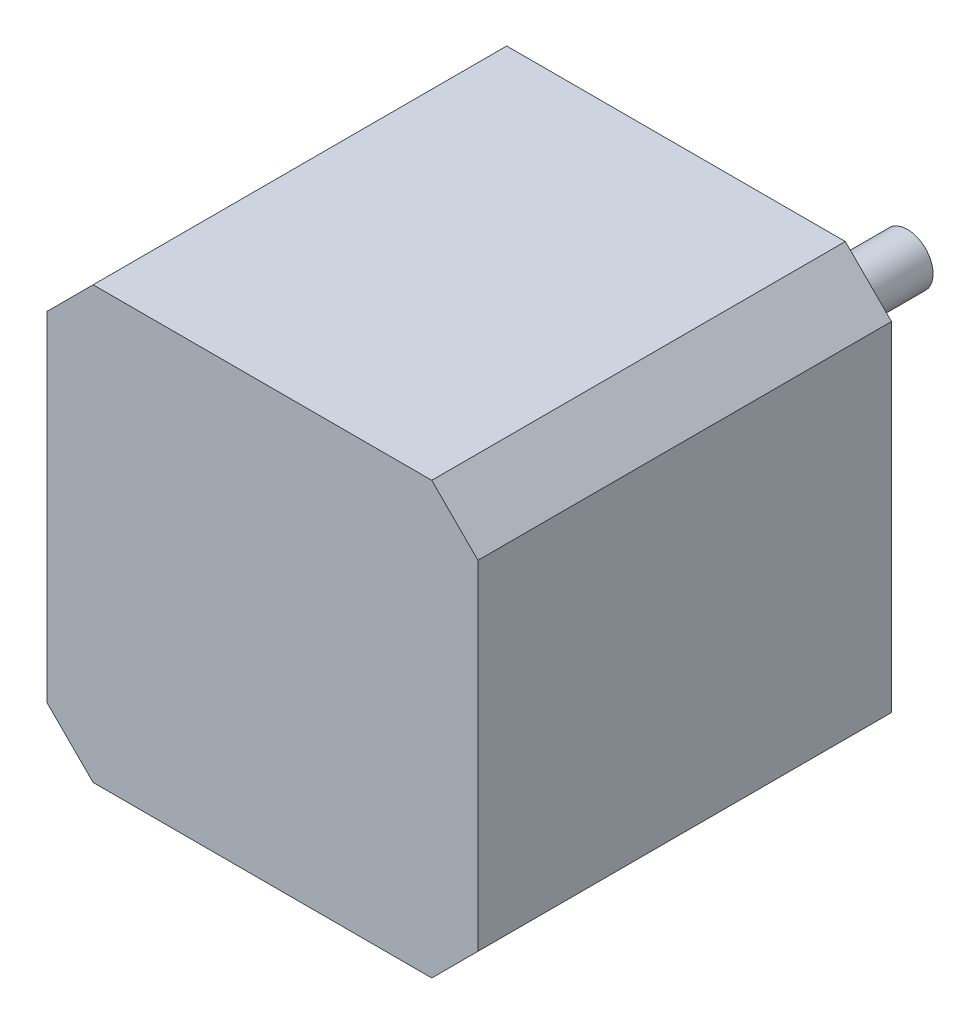
ISO-10303-21;
HEADER;
FILE_DESCRIPTION(('STEP AP214'),'2;1');
FILE_NAME('part.step','',(''),(''),'','','');
FILE_SCHEMA(('AUTOMOTIVE_DESIGN { 1 0 10303 214 1 1 1 1 }'));
ENDSEC;
DATA;
#1=APPLICATION_CONTEXT('core data for automotive mechanical design processes');
#2=APPLICATION_PROTOCOL_DEFINITION('international standard','automotive_design',2000,#1);
#3=PRODUCT_CONTEXT('',#1,'mechanical');
#4=PRODUCT('Part','Part','',(#3));
#5=PRODUCT_RELATED_PRODUCT_CATEGORY('part','',(#4));
#6=PRODUCT_DEFINITION_FORMATION('','',#4);
#7=PRODUCT_DEFINITION_CONTEXT('part definition',#1,'design');
#8=PRODUCT_DEFINITION('design','',#6,#7);
#9=PRODUCT_DEFINITION_SHAPE('','',#8);
#10=(LENGTH_UNIT() NAMED_UNIT(*) SI_UNIT(.MILLI.,.METRE.));
#11=(NAMED_UNIT(*) PLANE_ANGLE_UNIT() SI_UNIT($,.RADIAN.));
#12=(NAMED_UNIT(*) SI_UNIT($,.STERADIAN.) SOLID_ANGLE_UNIT());
#13=UNCERTAINTY_MEASURE_WITH_UNIT(LENGTH_MEASURE(1.E-05),#10,'distance_accuracy_value','');
#14=(GEOMETRIC_REPRESENTATION_CONTEXT(3) GLOBAL_UNCERTAINTY_ASSIGNED_CONTEXT((#13)) GLOBAL_UNIT_ASSIGNED_CONTEXT((#10,
#11,#12)) REPRESENTATION_CONTEXT('',''));
#15=CARTESIAN_POINT('',(0.,0.,0.));
#16=DIRECTION('',(0.,0.,1.));
#17=DIRECTION('',(1.,0.,0.));
#18=AXIS2_PLACEMENT_3D('',#15,#16,#17);
#19=CARTESIAN_POINT('',(0.,-21.,40.3));
#20=DIRECTION('',(0.,1.,0.));
#21=DIRECTION('',(0.,0.,1.));
#22=AXIS2_PLACEMENT_3D('',#19,#20,#21);
#23=PLANE('',#22);
#24=DIRECTION('',(1.,0.,0.));
#25=VECTOR('',#24,1.);
#26=CARTESIAN_POINT('',(0.,-21.,0.));
#27=LINE('',#26,#25);
#28=CARTESIAN_POINT('',(-16.5,-21.,0.));
#29=VERTEX_POINT('',#28);
#30=CARTESIAN_POINT('',(16.5,-21.,0.));
#31=VERTEX_POINT('',#30);
#32=EDGE_CURVE('E162',#29,#31,#27,.T.);
#33=ORIENTED_EDGE('',*,*,#32,.T.);
#34=DIRECTION('',(0.,0.,1.));
#35=VECTOR('',#34,1.);
#36=CARTESIAN_POINT('',(16.5,-21.,40.3));
#37=LINE('',#36,#35);
#38=CARTESIAN_POINT('',(16.5,-21.,40.3));
#39=VERTEX_POINT('',#38);
#40=EDGE_CURVE('E147',#31,#39,#37,.T.);
#41=ORIENTED_EDGE('',*,*,#40,.T.);
#42=DIRECTION('',(1.,0.,0.));
#43=VECTOR('',#42,1.);
#44=CARTESIAN_POINT('',(0.,-21.,40.3));
#45=LINE('',#44,#43);
#46=CARTESIAN_POINT('',(-16.5,-21.,40.3));
#47=VERTEX_POINT('',#46);
#48=EDGE_CURVE('E164',#47,#39,#45,.T.);
#49=ORIENTED_EDGE('',*,*,#48,.F.);
#50=DIRECTION('',(0.,0.,-1.));
#51=VECTOR('',#50,1.);
#52=CARTESIAN_POINT('',(-16.5,-21.,0.));
#53=LINE('',#52,#51);
#54=EDGE_CURVE('E144',#47,#29,#53,.T.);
#55=ORIENTED_EDGE('',*,*,#54,.T.);
#56=EDGE_LOOP('',(#33,#41,#49,#55));
#57=FACE_BOUND('',#56,.T.);
#58=ADVANCED_FACE('F34',(#57),#23,.F.);
#59=CARTESIAN_POINT('',(21.,0.,40.3));
#60=DIRECTION('',(-1.,0.,0.));
#61=DIRECTION('',(0.,0.,1.));
#62=AXIS2_PLACEMENT_3D('',#59,#60,#61);
#63=PLANE('',#62);
#64=DIRECTION('',(0.,1.,0.));
#65=VECTOR('',#64,1.);
#66=CARTESIAN_POINT('',(21.,0.,0.));
#67=LINE('',#66,#65);
#68=CARTESIAN_POINT('',(21.,-16.5,0.));
#69=VERTEX_POINT('',#68);
#70=CARTESIAN_POINT('',(21.,16.5,0.));
#71=VERTEX_POINT('',#70);
#72=EDGE_CURVE('E118',#69,#71,#67,.T.);
#73=ORIENTED_EDGE('',*,*,#72,.T.);
#74=DIRECTION('',(0.,0.,1.));
#75=VECTOR('',#74,1.);
#76=CARTESIAN_POINT('',(21.,16.5,40.3));
#77=LINE('',#76,#75);
#78=CARTESIAN_POINT('',(21.,16.5,40.3));
#79=VERTEX_POINT('',#78);
#80=EDGE_CURVE('E135',#71,#79,#77,.T.);
#81=ORIENTED_EDGE('',*,*,#80,.T.);
#82=DIRECTION('',(0.,1.,0.));
#83=VECTOR('',#82,1.);
#84=CARTESIAN_POINT('',(21.,0.,40.3));
#85=LINE('',#84,#83);
#86=CARTESIAN_POINT('',(21.,-16.5,40.3));
#87=VERTEX_POINT('',#86);
#88=EDGE_CURVE('E175',#87,#79,#85,.T.);
#89=ORIENTED_EDGE('',*,*,#88,.F.);
#90=DIRECTION('',(0.,0.,-1.));
#91=VECTOR('',#90,1.);
#92=CARTESIAN_POINT('',(21.,-16.5,40.3));
#93=LINE('',#92,#91);
#94=EDGE_CURVE('E132',#87,#69,#93,.T.);
#95=ORIENTED_EDGE('',*,*,#94,.T.);
#96=EDGE_LOOP('',(#73,#81,#89,#95));
#97=FACE_BOUND('',#96,.T.);
#98=ADVANCED_FACE('F254',(#97),#63,.F.);
#99=CARTESIAN_POINT('',(0.,21.,40.3));
#100=DIRECTION('',(0.,1.,0.));
#101=DIRECTION('',(0.,0.,1.));
#102=AXIS2_PLACEMENT_3D('',#99,#100,#101);
#103=PLANE('',#102);
#104=DIRECTION('',(1.,0.,0.));
#105=VECTOR('',#104,1.);
#106=CARTESIAN_POINT('',(0.,21.,40.3));
#107=LINE('',#106,#105);
#108=CARTESIAN_POINT('',(-16.5,21.,40.3));
#109=VERTEX_POINT('',#108);
#110=CARTESIAN_POINT('',(16.5,21.,40.3));
#111=VERTEX_POINT('',#110);
#112=EDGE_CURVE('E123',#109,#111,#107,.T.);
#113=ORIENTED_EDGE('',*,*,#112,.T.);
#114=DIRECTION('',(0.,0.,-1.));
#115=VECTOR('',#114,1.);
#116=CARTESIAN_POINT('',(16.5,21.,0.));
#117=LINE('',#116,#115);
#118=CARTESIAN_POINT('',(16.5,21.,0.));
#119=VERTEX_POINT('',#118);
#120=EDGE_CURVE('E110',#111,#119,#117,.T.);
#121=ORIENTED_EDGE('',*,*,#120,.T.);
#122=DIRECTION('',(1.,0.,0.));
#123=VECTOR('',#122,1.);
#124=CARTESIAN_POINT('',(0.,21.,0.));
#125=LINE('',#124,#123);
#126=CARTESIAN_POINT('',(-16.5,21.,0.));
#127=VERTEX_POINT('',#126);
#128=EDGE_CURVE('E103',#127,#119,#125,.T.);
#129=ORIENTED_EDGE('',*,*,#128,.F.);
#130=DIRECTION('',(0.,0.,1.));
#131=VECTOR('',#130,1.);
#132=CARTESIAN_POINT('',(-16.5,21.,40.3));
#133=LINE('',#132,#131);
#134=EDGE_CURVE('E116',#127,#109,#133,.T.);
#135=ORIENTED_EDGE('',*,*,#134,.T.);
#136=EDGE_LOOP('',(#113,#121,#129,#135));
#137=FACE_BOUND('',#136,.T.);
#138=ADVANCED_FACE('F115',(#137),#103,.T.);
#139=CARTESIAN_POINT('',(-21.,0.,40.3));
#140=DIRECTION('',(-1.,0.,0.));
#141=DIRECTION('',(0.,0.,1.));
#142=AXIS2_PLACEMENT_3D('',#139,#140,#141);
#143=PLANE('',#142);
#144=DIRECTION('',(0.,1.,0.));
#145=VECTOR('',#144,1.);
#146=CARTESIAN_POINT('',(-21.,0.,0.));
#147=LINE('',#146,#145);
#148=CARTESIAN_POINT('',(-21.,-16.5,0.));
#149=VERTEX_POINT('',#148);
#150=CARTESIAN_POINT('',(-21.,16.5,0.));
#151=VERTEX_POINT('',#150);
#152=EDGE_CURVE('E104',#149,#151,#147,.T.);
#153=ORIENTED_EDGE('',*,*,#152,.F.);
#154=DIRECTION('',(0.,0.,1.));
#155=VECTOR('',#154,1.);
#156=CARTESIAN_POINT('',(-21.,-16.5,40.3));
#157=LINE('',#156,#155);
#158=CARTESIAN_POINT('',(-21.,-16.5,40.3));
#159=VERTEX_POINT('',#158);
#160=EDGE_CURVE('E42',#149,#159,#157,.T.);
#161=ORIENTED_EDGE('',*,*,#160,.T.);
#162=DIRECTION('',(0.,1.,0.));
#163=VECTOR('',#162,1.);
#164=CARTESIAN_POINT('',(-21.,0.,40.3));
#165=LINE('',#164,#163);
#166=CARTESIAN_POINT('',(-21.,16.5,40.3));
#167=VERTEX_POINT('',#166);
#168=EDGE_CURVE('E120',#159,#167,#165,.T.);
#169=ORIENTED_EDGE('',*,*,#168,.T.);
#170=DIRECTION('',(0.,0.,-1.));
#171=VECTOR('',#170,1.);
#172=CARTESIAN_POINT('',(-21.,16.5,40.3));
#173=LINE('',#172,#171);
#174=EDGE_CURVE('E149',#167,#151,#173,.T.);
#175=ORIENTED_EDGE('',*,*,#174,.T.);
#176=EDGE_LOOP('',(#153,#161,#169,#175));
#177=FACE_BOUND('',#176,.T.);
#178=ADVANCED_FACE('F150',(#177),#143,.T.);
#179=CARTESIAN_POINT('',(0.,0.,40.3));
#180=DIRECTION('',(0.,0.,1.));
#181=DIRECTION('',(1.,0.,0.));
#182=AXIS2_PLACEMENT_3D('',#179,#180,#181);
#183=PLANE('',#182);
#184=ORIENTED_EDGE('',*,*,#88,.T.);
#185=DIRECTION('',(-0.707106781186546,0.707106781186549,0.));
#186=VECTOR('',#185,1.);
#187=CARTESIAN_POINT('',(18.75,18.75,40.3));
#188=LINE('',#187,#186);
#189=EDGE_CURVE('E142',#79,#111,#188,.T.);
#190=ORIENTED_EDGE('',*,*,#189,.T.);
#191=ORIENTED_EDGE('',*,*,#112,.F.);
#192=DIRECTION('',(0.707106781186549,0.707106781186546,0.));
#193=VECTOR('',#192,1.);
#194=CARTESIAN_POINT('',(-18.75,18.75,40.3));
#195=LINE('',#194,#193);
#196=EDGE_CURVE('E49',#109,#167,#195,.F.);
#197=ORIENTED_EDGE('',*,*,#196,.T.);
#198=ORIENTED_EDGE('',*,*,#168,.F.);
#199=DIRECTION('',(0.707106781186545,-0.70710678118655,0.));
#200=VECTOR('',#199,1.);
#201=CARTESIAN_POINT('',(-18.7500000000001,-18.7499999999999,40.3));
#202=LINE('',#201,#200);
#203=EDGE_CURVE('E138',#159,#47,#202,.T.);
#204=ORIENTED_EDGE('',*,*,#203,.T.);
#205=ORIENTED_EDGE('',*,*,#48,.T.);
#206=DIRECTION('',(-0.70710678118655,-0.707106781186545,0.));
#207=VECTOR('',#206,1.);
#208=CARTESIAN_POINT('',(18.7499999999999,-18.7500000000001,40.3));
#209=LINE('',#208,#207);
#210=EDGE_CURVE('E140',#39,#87,#209,.F.);
#211=ORIENTED_EDGE('',*,*,#210,.T.);
#212=EDGE_LOOP('',(#184,#190,#191,#197,#198,#204,#205,#211));
#213=FACE_BOUND('',#212,.T.);
#214=ADVANCED_FACE('F153',(#213),#183,.T.);
#215=CARTESIAN_POINT('',(0.,0.,0.));
#216=DIRECTION('',(0.,0.,1.));
#217=DIRECTION('',(1.,0.,0.));
#218=AXIS2_PLACEMENT_3D('',#215,#216,#217);
#219=PLANE('',#218);
#220=CARTESIAN_POINT('',(0.,0.,0.));
#221=DIRECTION('',(0.,0.,1.));
#222=DIRECTION('',(1.,0.,0.));
#223=AXIS2_PLACEMENT_3D('',#220,#221,#222);
#224=CIRCLE('',#223,11.);
#225=CARTESIAN_POINT('',(11.,0.,0.));
#226=VERTEX_POINT('',#225);
#227=EDGE_CURVE('E199',#226,#226,#224,.T.);
#228=ORIENTED_EDGE('',*,*,#227,.T.);
#229=EDGE_LOOP('',(#228));
#230=FACE_BOUND('',#229,.T.);
#231=CARTESIAN_POINT('',(-15.5,15.4999999999991,0.));
#232=DIRECTION('',(0.,0.,1.));
#233=DIRECTION('',(1.,0.,0.));
#234=AXIS2_PLACEMENT_3D('',#231,#232,#233);
#235=CIRCLE('',#234,1.50000000000095);
#236=CARTESIAN_POINT('',(-13.9999999999991,15.4999999999991,0.));
#237=VERTEX_POINT('',#236);
#238=EDGE_CURVE('E194',#237,#237,#235,.T.);
#239=ORIENTED_EDGE('',*,*,#238,.T.);
#240=EDGE_LOOP('',(#239));
#241=FACE_BOUND('',#240,.T.);
#242=CARTESIAN_POINT('',(15.5000000000009,-15.5,0.));
#243=DIRECTION('',(0.,0.,1.));
#244=DIRECTION('',(1.,0.,0.));
#245=AXIS2_PLACEMENT_3D('',#242,#243,#244);
#246=CIRCLE('',#245,1.49999999999978);
#247=CARTESIAN_POINT('',(17.0000000000007,-15.5,0.));
#248=VERTEX_POINT('',#247);
#249=EDGE_CURVE('E188',#248,#248,#246,.T.);
#250=ORIENTED_EDGE('',*,*,#249,.T.);
#251=EDGE_LOOP('',(#250));
#252=FACE_BOUND('',#251,.T.);
#253=CARTESIAN_POINT('',(-15.4999999999991,-15.5000000000009,0.));
#254=DIRECTION('',(0.,0.,1.));
#255=DIRECTION('',(1.,0.,0.));
#256=AXIS2_PLACEMENT_3D('',#253,#254,#255);
#257=CIRCLE('',#256,1.50000000000066);
#258=CARTESIAN_POINT('',(-13.9999999999985,-15.5000000000009,0.));
#259=VERTEX_POINT('',#258);
#260=EDGE_CURVE('E181',#259,#259,#257,.T.);
#261=ORIENTED_EDGE('',*,*,#260,.T.);
#262=EDGE_LOOP('',(#261));
#263=FACE_BOUND('',#262,.T.);
#264=CARTESIAN_POINT('',(15.5,15.5,0.));
#265=DIRECTION('',(0.,0.,1.));
#266=DIRECTION('',(1.,0.,0.));
#267=AXIS2_PLACEMENT_3D('',#264,#265,#266);
#268=CIRCLE('',#267,1.5);
#269=CARTESIAN_POINT('',(17.,15.5,0.));
#270=VERTEX_POINT('',#269);
#271=EDGE_CURVE('E171',#270,#270,#268,.T.);
#272=ORIENTED_EDGE('',*,*,#271,.T.);
#273=EDGE_LOOP('',(#272));
#274=FACE_BOUND('',#273,.T.);
#275=ORIENTED_EDGE('',*,*,#128,.T.);
#276=DIRECTION('',(0.707106781186546,-0.707106781186549,0.));
#277=VECTOR('',#276,1.);
#278=CARTESIAN_POINT('',(16.5,21.,0.));
#279=LINE('',#278,#277);
#280=EDGE_CURVE('E130',#119,#71,#279,.T.);
#281=ORIENTED_EDGE('',*,*,#280,.T.);
#282=ORIENTED_EDGE('',*,*,#72,.F.);
#283=DIRECTION('',(0.70710678118655,0.707106781186545,0.));
#284=VECTOR('',#283,1.);
#285=CARTESIAN_POINT('',(21.,-16.5,0.));
#286=LINE('',#285,#284);
#287=EDGE_CURVE('E128',#69,#31,#286,.F.);
#288=ORIENTED_EDGE('',*,*,#287,.T.);
#289=ORIENTED_EDGE('',*,*,#32,.F.);
#290=DIRECTION('',(-0.707106781186545,0.70710678118655,0.));
#291=VECTOR('',#290,1.);
#292=CARTESIAN_POINT('',(-16.5,-21.,0.));
#293=LINE('',#292,#291);
#294=EDGE_CURVE('E109',#29,#149,#293,.T.);
#295=ORIENTED_EDGE('',*,*,#294,.T.);
#296=ORIENTED_EDGE('',*,*,#152,.T.);
#297=DIRECTION('',(-0.707106781186549,-0.707106781186546,0.));
#298=VECTOR('',#297,1.);
#299=CARTESIAN_POINT('',(-21.,16.5,0.));
#300=LINE('',#299,#298);
#301=EDGE_CURVE('E100',#151,#127,#300,.F.);
#302=ORIENTED_EDGE('',*,*,#301,.T.);
#303=EDGE_LOOP('',(#275,#281,#282,#288,#289,#295,#296,#302));
#304=FACE_BOUND('',#303,.T.);
#305=ADVANCED_FACE('F102',(#230,#241,#252,#263,#274,#304),#219,.F.);
#306=CARTESIAN_POINT('',(15.5,15.5,5.));
#307=DIRECTION('',(0.,0.,-1.));
#308=DIRECTION('',(-1.,0.,0.));
#309=AXIS2_PLACEMENT_3D('',#306,#307,#308);
#310=CYLINDRICAL_SURFACE('',#309,1.5);
#311=CARTESIAN_POINT('',(15.5,15.5,5.));
#312=DIRECTION('',(0.,0.,1.));
#313=DIRECTION('',(1.,0.,0.));
#314=AXIS2_PLACEMENT_3D('',#311,#312,#313);
#315=CIRCLE('',#314,1.5);
#316=CARTESIAN_POINT('',(17.,15.5,5.));
#317=VERTEX_POINT('',#316);
#318=EDGE_CURVE('E166',#317,#317,#315,.T.);
#319=ORIENTED_EDGE('',*,*,#318,.T.);
#320=EDGE_LOOP('',(#319));
#321=FACE_BOUND('',#320,.T.);
#322=ORIENTED_EDGE('',*,*,#271,.F.);
#323=EDGE_LOOP('',(#322));
#324=FACE_BOUND('',#323,.T.);
#325=ADVANCED_FACE('F232',(#321,#324),#310,.F.);
#326=CARTESIAN_POINT('',(0.,0.,5.));
#327=DIRECTION('',(0.,0.,1.));
#328=DIRECTION('',(1.,0.,0.));
#329=AXIS2_PLACEMENT_3D('',#326,#327,#328);
#330=PLANE('',#329);
#331=ORIENTED_EDGE('',*,*,#318,.F.);
#332=EDGE_LOOP('',(#331));
#333=FACE_BOUND('',#332,.T.);
#334=ADVANCED_FACE('F243',(#333),#330,.F.);
#335=CARTESIAN_POINT('',(-15.4999999999991,-15.5000000000009,5.));
#336=DIRECTION('',(0.,0.,-1.));
#337=DIRECTION('',(-1.,0.,0.));
#338=AXIS2_PLACEMENT_3D('',#335,#336,#337);
#339=CYLINDRICAL_SURFACE('',#338,1.50000000000066);
#340=CARTESIAN_POINT('',(-15.4999999999991,-15.5000000000009,5.));
#341=DIRECTION('',(0.,0.,1.));
#342=DIRECTION('',(1.,0.,0.));
#343=AXIS2_PLACEMENT_3D('',#340,#341,#342);
#344=CIRCLE('',#343,1.50000000000066);
#345=CARTESIAN_POINT('',(-13.9999999999985,-15.5000000000009,5.));
#346=VERTEX_POINT('',#345);
#347=EDGE_CURVE('E184',#346,#346,#344,.T.);
#348=ORIENTED_EDGE('',*,*,#347,.T.);
#349=EDGE_LOOP('',(#348));
#350=FACE_BOUND('',#349,.T.);
#351=ORIENTED_EDGE('',*,*,#260,.F.);
#352=EDGE_LOOP('',(#351));
#353=FACE_BOUND('',#352,.T.);
#354=ADVANCED_FACE('F249',(#350,#353),#339,.F.);
#355=CARTESIAN_POINT('',(0.,0.,5.));
#356=DIRECTION('',(0.,0.,1.));
#357=DIRECTION('',(1.,0.,0.));
#358=AXIS2_PLACEMENT_3D('',#355,#356,#357);
#359=PLANE('',#358);
#360=ORIENTED_EDGE('',*,*,#347,.F.);
#361=EDGE_LOOP('',(#360));
#362=FACE_BOUND('',#361,.T.);
#363=ADVANCED_FACE('F351',(#362),#359,.F.);
#364=CARTESIAN_POINT('',(15.5000000000009,-15.5,5.));
#365=DIRECTION('',(0.,0.,-1.));
#366=DIRECTION('',(-1.,0.,0.));
#367=AXIS2_PLACEMENT_3D('',#364,#365,#366);
#368=CYLINDRICAL_SURFACE('',#367,1.49999999999978);
#369=CARTESIAN_POINT('',(15.5000000000009,-15.5,5.));
#370=DIRECTION('',(0.,0.,1.));
#371=DIRECTION('',(1.,0.,0.));
#372=AXIS2_PLACEMENT_3D('',#369,#370,#371);
#373=CIRCLE('',#372,1.49999999999978);
#374=CARTESIAN_POINT('',(17.0000000000007,-15.5,5.));
#375=VERTEX_POINT('',#374);
#376=EDGE_CURVE('E191',#375,#375,#373,.T.);
#377=ORIENTED_EDGE('',*,*,#376,.T.);
#378=EDGE_LOOP('',(#377));
#379=FACE_BOUND('',#378,.T.);
#380=ORIENTED_EDGE('',*,*,#249,.F.);
#381=EDGE_LOOP('',(#380));
#382=FACE_BOUND('',#381,.T.);
#383=ADVANCED_FACE('F342',(#379,#382),#368,.F.);
#384=CARTESIAN_POINT('',(0.,0.,5.));
#385=DIRECTION('',(0.,0.,1.));
#386=DIRECTION('',(1.,0.,0.));
#387=AXIS2_PLACEMENT_3D('',#384,#385,#386);
#388=PLANE('',#387);
#389=ORIENTED_EDGE('',*,*,#376,.F.);
#390=EDGE_LOOP('',(#389));
#391=FACE_BOUND('',#390,.T.);
#392=ADVANCED_FACE('F333',(#391),#388,.F.);
#393=CARTESIAN_POINT('',(-15.5,15.4999999999991,5.));
#394=DIRECTION('',(0.,0.,-1.));
#395=DIRECTION('',(-1.,0.,0.));
#396=AXIS2_PLACEMENT_3D('',#393,#394,#395);
#397=CYLINDRICAL_SURFACE('',#396,1.50000000000095);
#398=CARTESIAN_POINT('',(-15.5,15.4999999999991,5.));
#399=DIRECTION('',(0.,0.,1.));
#400=DIRECTION('',(1.,0.,0.));
#401=AXIS2_PLACEMENT_3D('',#398,#399,#400);
#402=CIRCLE('',#401,1.50000000000095);
#403=CARTESIAN_POINT('',(-13.9999999999991,15.4999999999991,5.));
#404=VERTEX_POINT('',#403);
#405=EDGE_CURVE('E179',#404,#404,#402,.T.);
#406=ORIENTED_EDGE('',*,*,#405,.T.);
#407=EDGE_LOOP('',(#406));
#408=FACE_BOUND('',#407,.T.);
#409=ORIENTED_EDGE('',*,*,#238,.F.);
#410=EDGE_LOOP('',(#409));
#411=FACE_BOUND('',#410,.T.);
#412=ADVANCED_FACE('F324',(#408,#411),#397,.F.);
#413=CARTESIAN_POINT('',(0.,0.,5.));
#414=DIRECTION('',(0.,0.,1.));
#415=DIRECTION('',(1.,0.,0.));
#416=AXIS2_PLACEMENT_3D('',#413,#414,#415);
#417=PLANE('',#416);
#418=ORIENTED_EDGE('',*,*,#405,.F.);
#419=EDGE_LOOP('',(#418));
#420=FACE_BOUND('',#419,.T.);
#421=ADVANCED_FACE('F226',(#420),#417,.F.);
#422=CARTESIAN_POINT('',(0.,0.,-1.8));
#423=DIRECTION('',(0.,0.,1.));
#424=DIRECTION('',(1.,0.,0.));
#425=AXIS2_PLACEMENT_3D('',#422,#423,#424);
#426=CYLINDRICAL_SURFACE('',#425,11.);
#427=CARTESIAN_POINT('',(0.,0.,-1.8));
#428=DIRECTION('',(0.,0.,1.));
#429=DIRECTION('',(1.,0.,0.));
#430=AXIS2_PLACEMENT_3D('',#427,#428,#429);
#431=CIRCLE('',#430,11.);
#432=CARTESIAN_POINT('',(11.,0.,-1.8));
#433=VERTEX_POINT('',#432);
#434=EDGE_CURVE('E185',#433,#433,#431,.T.);
#435=ORIENTED_EDGE('',*,*,#434,.T.);
#436=EDGE_LOOP('',(#435));
#437=FACE_BOUND('',#436,.T.);
#438=ORIENTED_EDGE('',*,*,#227,.F.);
#439=EDGE_LOOP('',(#438));
#440=FACE_BOUND('',#439,.T.);
#441=ADVANCED_FACE('F220',(#437,#440),#426,.T.);
#442=CARTESIAN_POINT('',(0.,0.,-1.8));
#443=DIRECTION('',(0.,0.,1.));
#444=DIRECTION('',(1.,0.,0.));
#445=AXIS2_PLACEMENT_3D('',#442,#443,#444);
#446=PLANE('',#445);
#447=CARTESIAN_POINT('',(0.,0.,-1.8));
#448=DIRECTION('',(0.,0.,1.));
#449=DIRECTION('',(1.,0.,0.));
#450=AXIS2_PLACEMENT_3D('',#447,#448,#449);
#451=CIRCLE('',#450,2.5);
#452=CARTESIAN_POINT('',(2.5,0.,-1.8));
#453=VERTEX_POINT('',#452);
#454=EDGE_CURVE('E11',#453,#453,#451,.F.);
#455=ORIENTED_EDGE('',*,*,#454,.F.);
#456=EDGE_LOOP('',(#455));
#457=FACE_BOUND('',#456,.T.);
#458=ORIENTED_EDGE('',*,*,#434,.F.);
#459=EDGE_LOOP('',(#458));
#460=FACE_BOUND('',#459,.T.);
#461=ADVANCED_FACE('F216',(#457,#460),#446,.F.);
#462=CARTESIAN_POINT('',(16.5,21.,40.3));
#463=DIRECTION('',(0.707106781186549,0.707106781186546,0.));
#464=DIRECTION('',(0.,0.,1.));
#465=AXIS2_PLACEMENT_3D('',#462,#463,#464);
#466=PLANE('',#465);
#467=ORIENTED_EDGE('',*,*,#189,.F.);
#468=ORIENTED_EDGE('',*,*,#80,.F.);
#469=ORIENTED_EDGE('',*,*,#280,.F.);
#470=ORIENTED_EDGE('',*,*,#120,.F.);
#471=EDGE_LOOP('',(#467,#468,#469,#470));
#472=FACE_BOUND('',#471,.T.);
#473=ADVANCED_FACE('F219',(#472),#466,.T.);
#474=CARTESIAN_POINT('',(21.,-16.5,40.3));
#475=DIRECTION('',(-0.707106781186545,0.70710678118655,0.));
#476=DIRECTION('',(0.,0.,-1.));
#477=AXIS2_PLACEMENT_3D('',#474,#475,#476);
#478=PLANE('',#477);
#479=ORIENTED_EDGE('',*,*,#210,.F.);
#480=ORIENTED_EDGE('',*,*,#40,.F.);
#481=ORIENTED_EDGE('',*,*,#287,.F.);
#482=ORIENTED_EDGE('',*,*,#94,.F.);
#483=EDGE_LOOP('',(#479,#480,#481,#482));
#484=FACE_BOUND('',#483,.T.);
#485=ADVANCED_FACE('F265',(#484),#478,.F.);
#486=CARTESIAN_POINT('',(-16.5,-21.,40.3));
#487=DIRECTION('',(-0.70710678118655,-0.707106781186545,0.));
#488=DIRECTION('',(0.,0.,1.));
#489=AXIS2_PLACEMENT_3D('',#486,#487,#488);
#490=PLANE('',#489);
#491=ORIENTED_EDGE('',*,*,#203,.F.);
#492=ORIENTED_EDGE('',*,*,#160,.F.);
#493=ORIENTED_EDGE('',*,*,#294,.F.);
#494=ORIENTED_EDGE('',*,*,#54,.F.);
#495=EDGE_LOOP('',(#491,#492,#493,#494));
#496=FACE_BOUND('',#495,.T.);
#497=ADVANCED_FACE('F158',(#496),#490,.T.);
#498=CARTESIAN_POINT('',(-21.,16.5,40.3));
#499=DIRECTION('',(0.707106781186546,-0.707106781186549,0.));
#500=DIRECTION('',(0.,0.,-1.));
#501=AXIS2_PLACEMENT_3D('',#498,#499,#500);
#502=PLANE('',#501);
#503=ORIENTED_EDGE('',*,*,#196,.F.);
#504=ORIENTED_EDGE('',*,*,#134,.F.);
#505=ORIENTED_EDGE('',*,*,#301,.F.);
#506=ORIENTED_EDGE('',*,*,#174,.F.);
#507=EDGE_LOOP('',(#503,#504,#505,#506));
#508=FACE_BOUND('',#507,.T.);
#509=ADVANCED_FACE('F36',(#508),#502,.F.);
#510=CARTESIAN_POINT('',(0.,0.,-22.55));
#511=DIRECTION('',(0.,0.,1.));
#512=DIRECTION('',(1.,0.,0.));
#513=AXIS2_PLACEMENT_3D('',#510,#511,#512);
#514=CYLINDRICAL_SURFACE('',#513,2.5);
#515=CARTESIAN_POINT('',(0.,0.,-22.55));
#516=DIRECTION('',(0.,0.,-1.));
#517=DIRECTION('',(-1.,0.,0.));
#518=AXIS2_PLACEMENT_3D('',#515,#516,#517);
#519=CIRCLE('',#518,2.5);
#520=CARTESIAN_POINT('',(-2.5,0.,-22.55));
#521=VERTEX_POINT('',#520);
#522=EDGE_CURVE('E202',#521,#521,#519,.T.);
#523=ORIENTED_EDGE('',*,*,#522,.F.);
#524=EDGE_LOOP('',(#523));
#525=FACE_BOUND('',#524,.T.);
#526=ORIENTED_EDGE('',*,*,#454,.T.);
#527=EDGE_LOOP('',(#526));
#528=FACE_BOUND('',#527,.T.);
#529=ADVANCED_FACE('F210',(#525,#528),#514,.T.);
#530=CARTESIAN_POINT('',(0.,0.,-22.55));
#531=DIRECTION('',(0.,0.,-1.));
#532=DIRECTION('',(-1.,0.,0.));
#533=AXIS2_PLACEMENT_3D('',#530,#531,#532);
#534=PLANE('',#533);
#535=ORIENTED_EDGE('',*,*,#522,.T.);
#536=EDGE_LOOP('',(#535));
#537=FACE_BOUND('',#536,.T.);
#538=ADVANCED_FACE('F208',(#537),#534,.T.);
#539=CLOSED_SHELL('',(#58,#98,#138,#178,#214,#305,#325,#334,#354,#363,#383,#392,#412,#421,#441,
#461,#473,#485,#497,#509,#529,#538));
#540=MANIFOLD_SOLID_BREP('B2',#539);
#541=ADVANCED_BREP_SHAPE_REPRESENTATION('',(#18,#540),#14);
#542=SHAPE_DEFINITION_REPRESENTATION(#9,#541);
ENDSEC;
END-ISO-10303-21;
